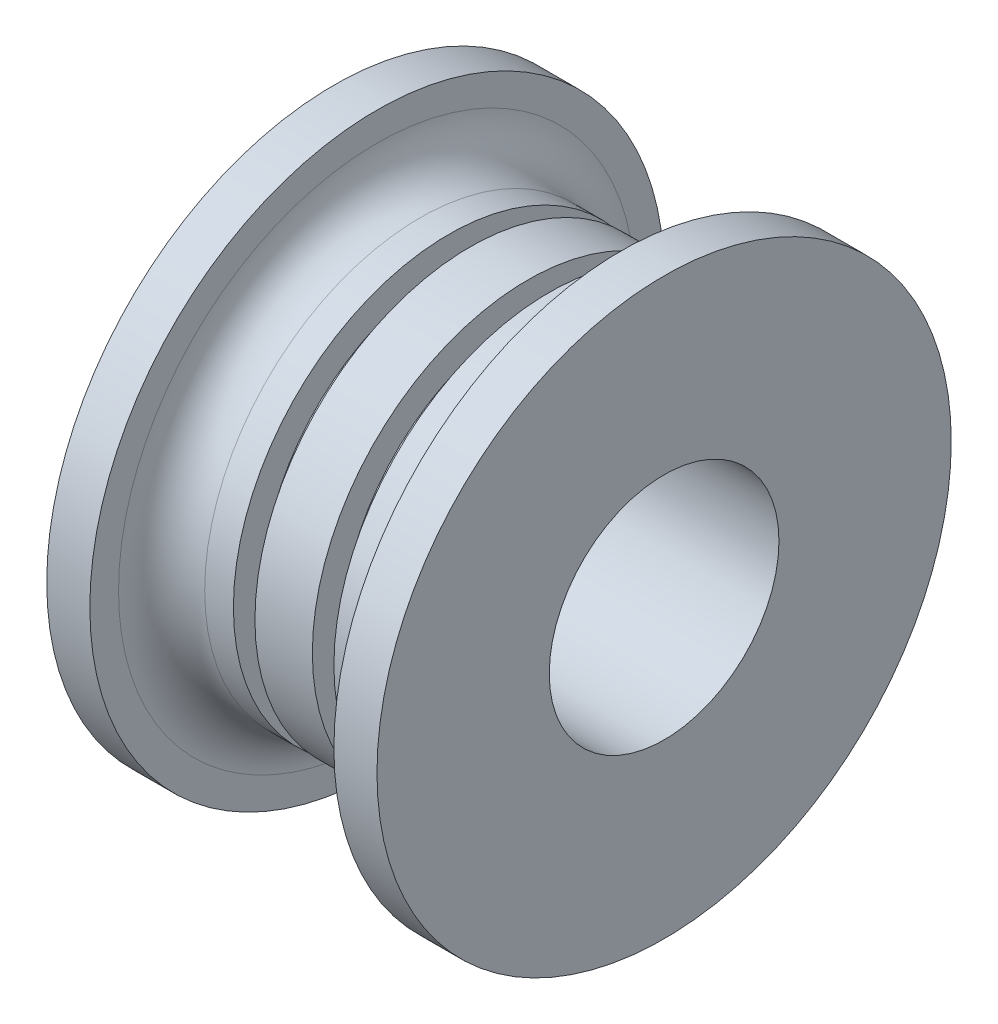
ISO-10303-21;
HEADER;
FILE_DESCRIPTION(('STEP AP214'),'2;1');
FILE_NAME('part.step','',(''),(''),'','','');
FILE_SCHEMA(('AUTOMOTIVE_DESIGN { 1 0 10303 214 1 1 1 1 }'));
ENDSEC;
DATA;
#1=APPLICATION_CONTEXT('core data for automotive mechanical design processes');
#2=APPLICATION_PROTOCOL_DEFINITION('international standard','automotive_design',2000,#1);
#3=PRODUCT_CONTEXT('',#1,'mechanical');
#4=PRODUCT('Part','Part','',(#3));
#5=PRODUCT_RELATED_PRODUCT_CATEGORY('part','',(#4));
#6=PRODUCT_DEFINITION_FORMATION('','',#4);
#7=PRODUCT_DEFINITION_CONTEXT('part definition',#1,'design');
#8=PRODUCT_DEFINITION('design','',#6,#7);
#9=PRODUCT_DEFINITION_SHAPE('','',#8);
#10=(LENGTH_UNIT() NAMED_UNIT(*) SI_UNIT(.MILLI.,.METRE.));
#11=(NAMED_UNIT(*) PLANE_ANGLE_UNIT() SI_UNIT($,.RADIAN.));
#12=(NAMED_UNIT(*) SI_UNIT($,.STERADIAN.) SOLID_ANGLE_UNIT());
#13=UNCERTAINTY_MEASURE_WITH_UNIT(LENGTH_MEASURE(1.E-05),#10,'distance_accuracy_value','');
#14=(GEOMETRIC_REPRESENTATION_CONTEXT(3) GLOBAL_UNCERTAINTY_ASSIGNED_CONTEXT((#13)) GLOBAL_UNIT_ASSIGNED_CONTEXT((#10,
#11,#12)) REPRESENTATION_CONTEXT('',''));
#15=CARTESIAN_POINT('',(0.,0.,0.));
#16=DIRECTION('',(0.,0.,1.));
#17=DIRECTION('',(1.,0.,0.));
#18=AXIS2_PLACEMENT_3D('',#15,#16,#17);
#19=CARTESIAN_POINT('',(170.,0.,0.));
#20=DIRECTION('',(-1.,0.,0.));
#21=DIRECTION('',(0.,0.,1.));
#22=AXIS2_PLACEMENT_3D('',#19,#20,#21);
#23=TOROIDAL_SURFACE('',#22,180.,30.);
#24=CARTESIAN_POINT('',(200.,0.,0.));
#25=DIRECTION('',(-1.,0.,0.));
#26=DIRECTION('',(0.,0.,1.));
#27=AXIS2_PLACEMENT_3D('',#24,#25,#26);
#28=CIRCLE('',#27,180.);
#29=CARTESIAN_POINT('',(200.,0.,180.));
#30=VERTEX_POINT('',#29);
#31=EDGE_CURVE('E100',#30,#30,#28,.T.);
#32=ORIENTED_EDGE('',*,*,#31,.T.);
#33=EDGE_LOOP('',(#32));
#34=FACE_BOUND('',#33,.T.);
#35=CARTESIAN_POINT('',(170.,0.,0.));
#36=DIRECTION('',(-1.,0.,0.));
#37=DIRECTION('',(0.,0.,1.));
#38=AXIS2_PLACEMENT_3D('',#35,#36,#37);
#39=CIRCLE('',#38,150.);
#40=CARTESIAN_POINT('',(170.,0.,150.));
#41=VERTEX_POINT('',#40);
#42=EDGE_CURVE('E10',#41,#41,#39,.T.);
#43=ORIENTED_EDGE('',*,*,#42,.F.);
#44=EDGE_LOOP('',(#43));
#45=FACE_BOUND('',#44,.T.);
#46=ADVANCED_FACE('F39',(#34,#45),#23,.F.);
#47=CARTESIAN_POINT('',(0.,0.,0.));
#48=DIRECTION('',(-1.,0.,0.));
#49=DIRECTION('',(0.,0.,1.));
#50=AXIS2_PLACEMENT_3D('',#47,#48,#49);
#51=CYLINDRICAL_SURFACE('',#50,150.);
#52=ORIENTED_EDGE('',*,*,#42,.T.);
#53=EDGE_LOOP('',(#52));
#54=FACE_BOUND('',#53,.T.);
#55=CARTESIAN_POINT('',(150.,0.,0.));
#56=DIRECTION('',(-1.,0.,0.));
#57=DIRECTION('',(0.,0.,1.));
#58=AXIS2_PLACEMENT_3D('',#55,#56,#57);
#59=CIRCLE('',#58,150.);
#60=CARTESIAN_POINT('',(150.,0.,150.));
#61=VERTEX_POINT('',#60);
#62=EDGE_CURVE('E44',#61,#61,#59,.T.);
#63=ORIENTED_EDGE('',*,*,#62,.F.);
#64=EDGE_LOOP('',(#63));
#65=FACE_BOUND('',#64,.T.);
#66=ADVANCED_FACE('F113',(#54,#65),#51,.T.);
#67=CARTESIAN_POINT('',(150.,0.,0.));
#68=DIRECTION('',(1.,0.,0.));
#69=DIRECTION('',(0.,0.,-1.));
#70=AXIS2_PLACEMENT_3D('',#67,#68,#69);
#71=PLANE('',#70);
#72=CARTESIAN_POINT('',(150.,0.,0.));
#73=DIRECTION('',(-1.,0.,0.));
#74=DIRECTION('',(0.,0.,1.));
#75=AXIS2_PLACEMENT_3D('',#72,#73,#74);
#76=CIRCLE('',#75,130.);
#77=CARTESIAN_POINT('',(150.,0.,130.));
#78=VERTEX_POINT('',#77);
#79=EDGE_CURVE('E47',#78,#78,#76,.T.);
#80=ORIENTED_EDGE('',*,*,#79,.F.);
#81=EDGE_LOOP('',(#80));
#82=FACE_BOUND('',#81,.T.);
#83=ORIENTED_EDGE('',*,*,#62,.T.);
#84=EDGE_LOOP('',(#83));
#85=FACE_BOUND('',#84,.T.);
#86=ADVANCED_FACE('F116',(#82,#85),#71,.F.);
#87=CARTESIAN_POINT('',(0.,0.,0.));
#88=DIRECTION('',(-1.,0.,0.));
#89=DIRECTION('',(0.,0.,1.));
#90=AXIS2_PLACEMENT_3D('',#87,#88,#89);
#91=CYLINDRICAL_SURFACE('',#90,130.);
#92=CARTESIAN_POINT('',(135.,0.,0.));
#93=DIRECTION('',(-1.,0.,0.));
#94=DIRECTION('',(0.,0.,1.));
#95=AXIS2_PLACEMENT_3D('',#92,#93,#94);
#96=CIRCLE('',#95,130.);
#97=CARTESIAN_POINT('',(135.,0.,130.));
#98=VERTEX_POINT('',#97);
#99=EDGE_CURVE('E52',#98,#98,#96,.T.);
#100=ORIENTED_EDGE('',*,*,#99,.F.);
#101=EDGE_LOOP('',(#100));
#102=FACE_BOUND('',#101,.T.);
#103=ORIENTED_EDGE('',*,*,#79,.T.);
#104=EDGE_LOOP('',(#103));
#105=FACE_BOUND('',#104,.T.);
#106=ADVANCED_FACE('F121',(#102,#105),#91,.T.);
#107=CARTESIAN_POINT('',(135.,0.,0.));
#108=DIRECTION('',(1.,0.,0.));
#109=DIRECTION('',(0.,0.,-1.));
#110=AXIS2_PLACEMENT_3D('',#107,#108,#109);
#111=PLANE('',#110);
#112=ORIENTED_EDGE('',*,*,#99,.T.);
#113=EDGE_LOOP('',(#112));
#114=FACE_BOUND('',#113,.T.);
#115=CARTESIAN_POINT('',(135.,0.,0.));
#116=DIRECTION('',(-1.,0.,0.));
#117=DIRECTION('',(0.,0.,1.));
#118=AXIS2_PLACEMENT_3D('',#115,#116,#117);
#119=CIRCLE('',#118,150.);
#120=CARTESIAN_POINT('',(135.,0.,150.));
#121=VERTEX_POINT('',#120);
#122=EDGE_CURVE('E59',#121,#121,#119,.T.);
#123=ORIENTED_EDGE('',*,*,#122,.F.);
#124=EDGE_LOOP('',(#123));
#125=FACE_BOUND('',#124,.T.);
#126=ADVANCED_FACE('F128',(#114,#125),#111,.T.);
#127=CARTESIAN_POINT('',(0.,0.,0.));
#128=DIRECTION('',(-1.,0.,0.));
#129=DIRECTION('',(0.,0.,1.));
#130=AXIS2_PLACEMENT_3D('',#127,#128,#129);
#131=CYLINDRICAL_SURFACE('',#130,150.);
#132=CARTESIAN_POINT('',(95.,0.,0.));
#133=DIRECTION('',(-1.,0.,0.));
#134=DIRECTION('',(0.,0.,1.));
#135=AXIS2_PLACEMENT_3D('',#132,#133,#134);
#136=CIRCLE('',#135,150.);
#137=CARTESIAN_POINT('',(95.,0.,150.));
#138=VERTEX_POINT('',#137);
#139=EDGE_CURVE('E62',#138,#138,#136,.T.);
#140=ORIENTED_EDGE('',*,*,#139,.F.);
#141=EDGE_LOOP('',(#140));
#142=FACE_BOUND('',#141,.T.);
#143=ORIENTED_EDGE('',*,*,#122,.T.);
#144=EDGE_LOOP('',(#143));
#145=FACE_BOUND('',#144,.T.);
#146=ADVANCED_FACE('F131',(#142,#145),#131,.T.);
#147=CARTESIAN_POINT('',(95.,0.,0.));
#148=DIRECTION('',(1.,0.,0.));
#149=DIRECTION('',(0.,0.,-1.));
#150=AXIS2_PLACEMENT_3D('',#147,#148,#149);
#151=PLANE('',#150);
#152=CARTESIAN_POINT('',(95.,0.,0.));
#153=DIRECTION('',(-1.,0.,0.));
#154=DIRECTION('',(0.,0.,1.));
#155=AXIS2_PLACEMENT_3D('',#152,#153,#154);
#156=CIRCLE('',#155,130.);
#157=CARTESIAN_POINT('',(95.,0.,130.));
#158=VERTEX_POINT('',#157);
#159=EDGE_CURVE('E61',#158,#158,#156,.T.);
#160=ORIENTED_EDGE('',*,*,#159,.F.);
#161=EDGE_LOOP('',(#160));
#162=FACE_BOUND('',#161,.T.);
#163=ORIENTED_EDGE('',*,*,#139,.T.);
#164=EDGE_LOOP('',(#163));
#165=FACE_BOUND('',#164,.T.);
#166=ADVANCED_FACE('F136',(#162,#165),#151,.F.);
#167=CARTESIAN_POINT('',(0.,0.,0.));
#168=DIRECTION('',(-1.,0.,0.));
#169=DIRECTION('',(0.,0.,1.));
#170=AXIS2_PLACEMENT_3D('',#167,#168,#169);
#171=CYLINDRICAL_SURFACE('',#170,130.);
#172=ORIENTED_EDGE('',*,*,#159,.T.);
#173=EDGE_LOOP('',(#172));
#174=FACE_BOUND('',#173,.T.);
#175=CARTESIAN_POINT('',(80.,0.,0.));
#176=DIRECTION('',(-1.,0.,0.));
#177=DIRECTION('',(0.,0.,1.));
#178=AXIS2_PLACEMENT_3D('',#175,#176,#177);
#179=CIRCLE('',#178,130.);
#180=CARTESIAN_POINT('',(80.,0.,130.));
#181=VERTEX_POINT('',#180);
#182=EDGE_CURVE('E70',#181,#181,#179,.T.);
#183=ORIENTED_EDGE('',*,*,#182,.F.);
#184=EDGE_LOOP('',(#183));
#185=FACE_BOUND('',#184,.T.);
#186=ADVANCED_FACE('F142',(#174,#185),#171,.T.);
#187=CARTESIAN_POINT('',(80.,0.,0.));
#188=DIRECTION('',(1.,0.,0.));
#189=DIRECTION('',(0.,0.,-1.));
#190=AXIS2_PLACEMENT_3D('',#187,#188,#189);
#191=PLANE('',#190);
#192=ORIENTED_EDGE('',*,*,#182,.T.);
#193=EDGE_LOOP('',(#192));
#194=FACE_BOUND('',#193,.T.);
#195=CARTESIAN_POINT('',(80.,0.,0.));
#196=DIRECTION('',(-1.,0.,0.));
#197=DIRECTION('',(0.,0.,1.));
#198=AXIS2_PLACEMENT_3D('',#195,#196,#197);
#199=CIRCLE('',#198,150.);
#200=CARTESIAN_POINT('',(80.,0.,150.));
#201=VERTEX_POINT('',#200);
#202=EDGE_CURVE('E67',#201,#201,#199,.T.);
#203=ORIENTED_EDGE('',*,*,#202,.F.);
#204=EDGE_LOOP('',(#203));
#205=FACE_BOUND('',#204,.T.);
#206=ADVANCED_FACE('F148',(#194,#205),#191,.T.);
#207=CARTESIAN_POINT('',(0.,0.,0.));
#208=DIRECTION('',(-1.,0.,0.));
#209=DIRECTION('',(0.,0.,1.));
#210=AXIS2_PLACEMENT_3D('',#207,#208,#209);
#211=CYLINDRICAL_SURFACE('',#210,150.);
#212=ORIENTED_EDGE('',*,*,#202,.T.);
#213=EDGE_LOOP('',(#212));
#214=FACE_BOUND('',#213,.T.);
#215=CARTESIAN_POINT('',(60.0000000000002,0.,0.));
#216=DIRECTION('',(-1.,0.,0.));
#217=DIRECTION('',(0.,0.,1.));
#218=AXIS2_PLACEMENT_3D('',#215,#216,#217);
#219=CIRCLE('',#218,150.);
#220=CARTESIAN_POINT('',(60.0000000000002,0.,150.));
#221=VERTEX_POINT('',#220);
#222=EDGE_CURVE('E71',#221,#221,#219,.T.);
#223=ORIENTED_EDGE('',*,*,#222,.F.);
#224=EDGE_LOOP('',(#223));
#225=FACE_BOUND('',#224,.T.);
#226=ADVANCED_FACE('F147',(#214,#225),#211,.T.);
#227=CARTESIAN_POINT('',(60.,0.,0.));
#228=DIRECTION('',(-1.,0.,0.));
#229=DIRECTION('',(0.,0.,1.));
#230=AXIS2_PLACEMENT_3D('',#227,#228,#229);
#231=TOROIDAL_SURFACE('',#230,180.,30.);
#232=ORIENTED_EDGE('',*,*,#222,.T.);
#233=EDGE_LOOP('',(#232));
#234=FACE_BOUND('',#233,.T.);
#235=CARTESIAN_POINT('',(30.,0.,0.));
#236=DIRECTION('',(-1.,0.,0.));
#237=DIRECTION('',(0.,0.,1.));
#238=AXIS2_PLACEMENT_3D('',#235,#236,#237);
#239=CIRCLE('',#238,180.);
#240=CARTESIAN_POINT('',(30.,0.,180.));
#241=VERTEX_POINT('',#240);
#242=EDGE_CURVE('E77',#241,#241,#239,.T.);
#243=ORIENTED_EDGE('',*,*,#242,.F.);
#244=EDGE_LOOP('',(#243));
#245=FACE_BOUND('',#244,.T.);
#246=ADVANCED_FACE('F152',(#234,#245),#231,.F.);
#247=CARTESIAN_POINT('',(30.,0.,0.));
#248=DIRECTION('',(1.,0.,0.));
#249=DIRECTION('',(0.,0.,-1.));
#250=AXIS2_PLACEMENT_3D('',#247,#248,#249);
#251=PLANE('',#250);
#252=ORIENTED_EDGE('',*,*,#242,.T.);
#253=EDGE_LOOP('',(#252));
#254=FACE_BOUND('',#253,.T.);
#255=CARTESIAN_POINT('',(30.,0.,0.));
#256=DIRECTION('',(-1.,0.,0.));
#257=DIRECTION('',(0.,0.,1.));
#258=AXIS2_PLACEMENT_3D('',#255,#256,#257);
#259=CIRCLE('',#258,200.);
#260=CARTESIAN_POINT('',(30.,0.,200.));
#261=VERTEX_POINT('',#260);
#262=EDGE_CURVE('E76',#261,#261,#259,.T.);
#263=ORIENTED_EDGE('',*,*,#262,.F.);
#264=EDGE_LOOP('',(#263));
#265=FACE_BOUND('',#264,.T.);
#266=ADVANCED_FACE('F158',(#254,#265),#251,.T.);
#267=CARTESIAN_POINT('',(0.,0.,0.));
#268=DIRECTION('',(-1.,0.,0.));
#269=DIRECTION('',(0.,0.,1.));
#270=AXIS2_PLACEMENT_3D('',#267,#268,#269);
#271=CYLINDRICAL_SURFACE('',#270,200.);
#272=ORIENTED_EDGE('',*,*,#262,.T.);
#273=EDGE_LOOP('',(#272));
#274=FACE_BOUND('',#273,.T.);
#275=CARTESIAN_POINT('',(0.,0.,0.));
#276=DIRECTION('',(-1.,0.,0.));
#277=DIRECTION('',(0.,0.,1.));
#278=AXIS2_PLACEMENT_3D('',#275,#276,#277);
#279=CIRCLE('',#278,200.);
#280=CARTESIAN_POINT('',(0.,0.,200.));
#281=VERTEX_POINT('',#280);
#282=EDGE_CURVE('E85',#281,#281,#279,.T.);
#283=ORIENTED_EDGE('',*,*,#282,.F.);
#284=EDGE_LOOP('',(#283));
#285=FACE_BOUND('',#284,.T.);
#286=ADVANCED_FACE('F165',(#274,#285),#271,.T.);
#287=CARTESIAN_POINT('',(0.,0.,0.));
#288=DIRECTION('',(1.,0.,0.));
#289=DIRECTION('',(0.,0.,-1.));
#290=AXIS2_PLACEMENT_3D('',#287,#288,#289);
#291=PLANE('',#290);
#292=CARTESIAN_POINT('',(0.,0.,0.));
#293=DIRECTION('',(-1.,0.,0.));
#294=DIRECTION('',(0.,0.,1.));
#295=AXIS2_PLACEMENT_3D('',#292,#293,#294);
#296=CIRCLE('',#295,80.);
#297=CARTESIAN_POINT('',(0.,0.,80.));
#298=VERTEX_POINT('',#297);
#299=EDGE_CURVE('E82',#298,#298,#296,.T.);
#300=ORIENTED_EDGE('',*,*,#299,.F.);
#301=EDGE_LOOP('',(#300));
#302=FACE_BOUND('',#301,.T.);
#303=ORIENTED_EDGE('',*,*,#282,.T.);
#304=EDGE_LOOP('',(#303));
#305=FACE_BOUND('',#304,.T.);
#306=ADVANCED_FACE('F167',(#302,#305),#291,.F.);
#307=CARTESIAN_POINT('',(0.,0.,0.));
#308=DIRECTION('',(-1.,0.,0.));
#309=DIRECTION('',(0.,0.,1.));
#310=AXIS2_PLACEMENT_3D('',#307,#308,#309);
#311=CYLINDRICAL_SURFACE('',#310,80.);
#312=CARTESIAN_POINT('',(230.,0.,0.));
#313=DIRECTION('',(-1.,0.,0.));
#314=DIRECTION('',(0.,0.,1.));
#315=AXIS2_PLACEMENT_3D('',#312,#313,#314);
#316=CIRCLE('',#315,80.);
#317=CARTESIAN_POINT('',(230.,0.,80.));
#318=VERTEX_POINT('',#317);
#319=EDGE_CURVE('E86',#318,#318,#316,.T.);
#320=ORIENTED_EDGE('',*,*,#319,.F.);
#321=EDGE_LOOP('',(#320));
#322=FACE_BOUND('',#321,.T.);
#323=ORIENTED_EDGE('',*,*,#299,.T.);
#324=EDGE_LOOP('',(#323));
#325=FACE_BOUND('',#324,.T.);
#326=ADVANCED_FACE('F168',(#322,#325),#311,.F.);
#327=CARTESIAN_POINT('',(230.,1.06396373193244E-13,0.));
#328=DIRECTION('',(1.,0.,0.));
#329=DIRECTION('',(0.,0.,-1.));
#330=AXIS2_PLACEMENT_3D('',#327,#328,#329);
#331=PLANE('',#330);
#332=ORIENTED_EDGE('',*,*,#319,.T.);
#333=EDGE_LOOP('',(#332));
#334=FACE_BOUND('',#333,.T.);
#335=CARTESIAN_POINT('',(230.,0.,0.));
#336=DIRECTION('',(-1.,0.,0.));
#337=DIRECTION('',(0.,0.,1.));
#338=AXIS2_PLACEMENT_3D('',#335,#336,#337);
#339=CIRCLE('',#338,200.);
#340=CARTESIAN_POINT('',(230.,0.,200.));
#341=VERTEX_POINT('',#340);
#342=EDGE_CURVE('E93',#341,#341,#339,.T.);
#343=ORIENTED_EDGE('',*,*,#342,.F.);
#344=EDGE_LOOP('',(#343));
#345=FACE_BOUND('',#344,.T.);
#346=ADVANCED_FACE('F112',(#334,#345),#331,.T.);
#347=CARTESIAN_POINT('',(0.,0.,0.));
#348=DIRECTION('',(-1.,0.,0.));
#349=DIRECTION('',(0.,0.,1.));
#350=AXIS2_PLACEMENT_3D('',#347,#348,#349);
#351=CYLINDRICAL_SURFACE('',#350,200.);
#352=CARTESIAN_POINT('',(200.,0.,0.));
#353=DIRECTION('',(-1.,0.,0.));
#354=DIRECTION('',(0.,0.,1.));
#355=AXIS2_PLACEMENT_3D('',#352,#353,#354);
#356=CIRCLE('',#355,200.);
#357=CARTESIAN_POINT('',(200.,0.,200.));
#358=VERTEX_POINT('',#357);
#359=EDGE_CURVE('E94',#358,#358,#356,.T.);
#360=ORIENTED_EDGE('',*,*,#359,.F.);
#361=EDGE_LOOP('',(#360));
#362=FACE_BOUND('',#361,.T.);
#363=ORIENTED_EDGE('',*,*,#342,.T.);
#364=EDGE_LOOP('',(#363));
#365=FACE_BOUND('',#364,.T.);
#366=ADVANCED_FACE('F104',(#362,#365),#351,.T.);
#367=CARTESIAN_POINT('',(200.,0.,0.));
#368=DIRECTION('',(-1.,0.,0.));
#369=DIRECTION('',(0.,0.,1.));
#370=AXIS2_PLACEMENT_3D('',#367,#368,#369);
#371=PLANE('',#370);
#372=ORIENTED_EDGE('',*,*,#359,.T.);
#373=EDGE_LOOP('',(#372));
#374=FACE_BOUND('',#373,.T.);
#375=ORIENTED_EDGE('',*,*,#31,.F.);
#376=EDGE_LOOP('',(#375));
#377=FACE_BOUND('',#376,.T.);
#378=ADVANCED_FACE('F103',(#374,#377),#371,.T.);
#379=CLOSED_SHELL('',(#46,#66,#86,#106,#126,#146,#166,#186,#206,#226,#246,#266,#286,#306,#326,
#346,#366,#378));
#380=MANIFOLD_SOLID_BREP('B2',#379);
#381=ADVANCED_BREP_SHAPE_REPRESENTATION('',(#18,#380),#14);
#382=SHAPE_DEFINITION_REPRESENTATION(#9,#381);
ENDSEC;
END-ISO-10303-21;
